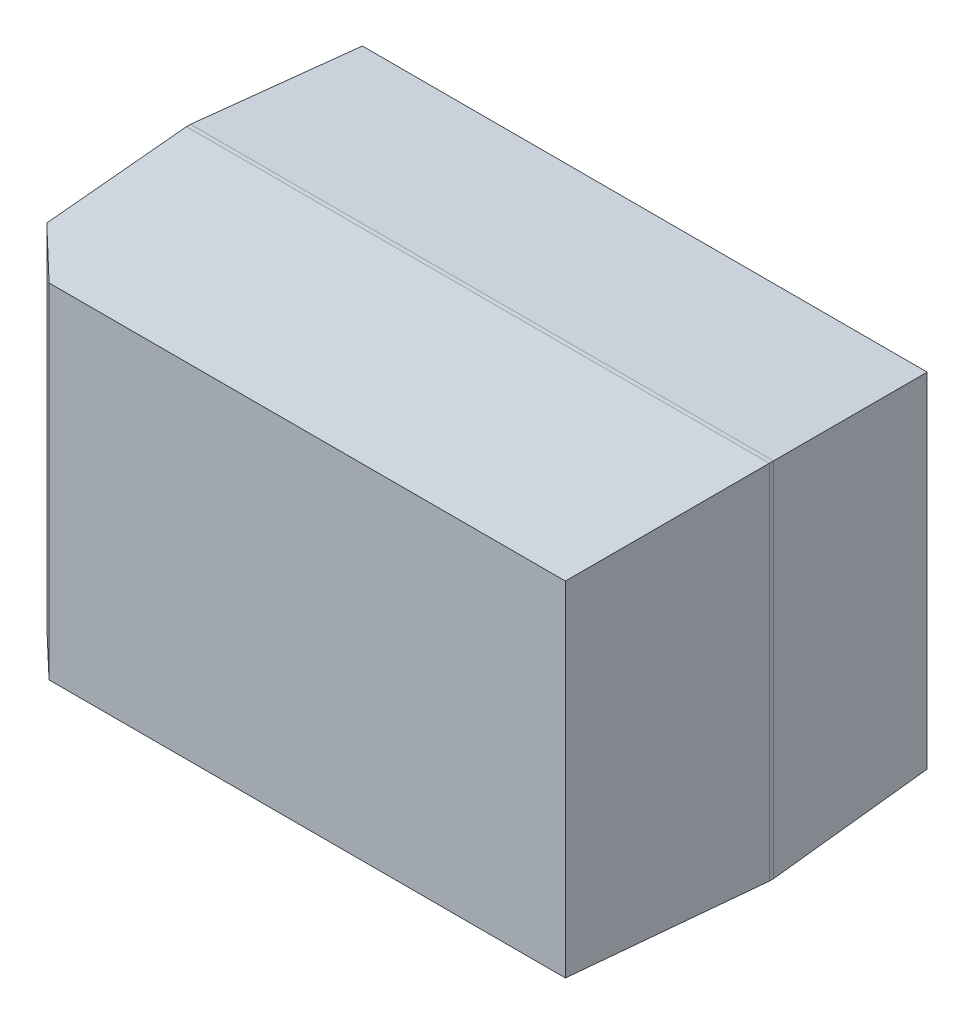
ISO-10303-21;
HEADER;
FILE_DESCRIPTION(('STEP AP214'),'2;1');
FILE_NAME('part.step','',(''),(''),'','','');
FILE_SCHEMA(('AUTOMOTIVE_DESIGN { 1 0 10303 214 1 1 1 1 }'));
ENDSEC;
DATA;
#1=APPLICATION_CONTEXT('core data for automotive mechanical design processes');
#2=APPLICATION_PROTOCOL_DEFINITION('international standard','automotive_design',2000,#1);
#3=PRODUCT_CONTEXT('',#1,'mechanical');
#4=PRODUCT('Part','Part','',(#3));
#5=PRODUCT_RELATED_PRODUCT_CATEGORY('part','',(#4));
#6=PRODUCT_DEFINITION_FORMATION('','',#4);
#7=PRODUCT_DEFINITION_CONTEXT('part definition',#1,'design');
#8=PRODUCT_DEFINITION('design','',#6,#7);
#9=PRODUCT_DEFINITION_SHAPE('','',#8);
#10=(LENGTH_UNIT() NAMED_UNIT(*) SI_UNIT(.MILLI.,.METRE.));
#11=(NAMED_UNIT(*) PLANE_ANGLE_UNIT() SI_UNIT($,.RADIAN.));
#12=(NAMED_UNIT(*) SI_UNIT($,.STERADIAN.) SOLID_ANGLE_UNIT());
#13=UNCERTAINTY_MEASURE_WITH_UNIT(LENGTH_MEASURE(1.E-05),#10,'distance_accuracy_value','');
#14=(GEOMETRIC_REPRESENTATION_CONTEXT(3) GLOBAL_UNCERTAINTY_ASSIGNED_CONTEXT((#13)) GLOBAL_UNIT_ASSIGNED_CONTEXT((#10,
#11,#12)) REPRESENTATION_CONTEXT('',''));
#15=CARTESIAN_POINT('',(0.,0.,0.));
#16=DIRECTION('',(0.,0.,1.));
#17=DIRECTION('',(1.,0.,0.));
#18=AXIS2_PLACEMENT_3D('',#15,#16,#17);
#19=CARTESIAN_POINT('',(-0.644883157121,-0.4275,0.939648242794));
#20=DIRECTION('',(0.690528091039103,0.,-0.723305575456108));
#21=DIRECTION('',(-0.723305575456108,0.,-0.690528091039103));
#22=AXIS2_PLACEMENT_3D('',#19,#20,#21);
#23=PLANE('',#22);
#24=DIRECTION('',(0.722934722308262,-0.0320183834640555,0.690174043558163));
#25=VECTOR('',#24,1.);
#26=CARTESIAN_POINT('',(-0.708099647576,0.433099647575812,0.879296485587991));
#27=LINE('',#26,#25);
#28=CARTESIAN_POINT('',(-0.708099647575812,0.433099647575953,0.879296485587847));
#29=VERTEX_POINT('',#28);
#30=CARTESIAN_POINT('',(-0.581666666666903,0.427499999999999,0.999999999999899));
#31=VERTEX_POINT('',#30);
#32=EDGE_CURVE('E112',#29,#31,#27,.T.);
#33=ORIENTED_EDGE('',*,*,#32,.F.);
#34=DIRECTION('',(0.,1.,0.));
#35=VECTOR('',#34,1.);
#36=CARTESIAN_POINT('',(-0.708099647575812,-0.45,0.879296485587991));
#37=LINE('',#36,#35);
#38=CARTESIAN_POINT('',(-0.708099647575811,-0.433099647575953,0.879296485587847));
#39=VERTEX_POINT('',#38);
#40=EDGE_CURVE('E98',#29,#39,#37,.F.);
#41=ORIENTED_EDGE('',*,*,#40,.T.);
#42=DIRECTION('',(0.722934722308262,0.0320183834640555,0.690174043558163));
#43=VECTOR('',#42,1.);
#44=CARTESIAN_POINT('',(-0.708099647576,-0.433099647575812,0.879296485587991));
#45=LINE('',#44,#43);
#46=CARTESIAN_POINT('',(-0.581666666666903,-0.427499999999998,0.999999999999899));
#47=VERTEX_POINT('',#46);
#48=EDGE_CURVE('E85',#39,#47,#45,.T.);
#49=ORIENTED_EDGE('',*,*,#48,.T.);
#50=DIRECTION('',(0.,1.,0.));
#51=VECTOR('',#50,1.);
#52=CARTESIAN_POINT('',(-0.581666666667,-0.45,1.));
#53=LINE('',#52,#51);
#54=EDGE_CURVE('E20',#31,#47,#53,.F.);
#55=ORIENTED_EDGE('',*,*,#54,.F.);
#56=EDGE_LOOP('',(#33,#41,#49,#55));
#57=FACE_BOUND('',#56,.T.);
#58=ADVANCED_FACE('F17',(#57),#23,.F.);
#59=CARTESIAN_POINT('',(-0.725,-0.45,1.));
#60=DIRECTION('',(0.,0.,1.));
#61=DIRECTION('',(1.,0.,0.));
#62=AXIS2_PLACEMENT_3D('',#59,#60,#61);
#63=PLANE('',#62);
#64=DIRECTION('',(1.,0.,0.));
#65=VECTOR('',#64,1.);
#66=CARTESIAN_POINT('',(-0.725,0.427499999999994,1.));
#67=LINE('',#66,#65);
#68=CARTESIAN_POINT('',(0.702499999999999,0.427499999999999,1.));
#69=VERTEX_POINT('',#68);
#70=EDGE_CURVE('E95',#31,#69,#67,.T.);
#71=ORIENTED_EDGE('',*,*,#70,.F.);
#72=ORIENTED_EDGE('',*,*,#54,.T.);
#73=DIRECTION('',(1.,0.,0.));
#74=VECTOR('',#73,1.);
#75=CARTESIAN_POINT('',(-0.725,-0.427499999999994,1.));
#76=LINE('',#75,#74);
#77=CARTESIAN_POINT('',(0.702499999999999,-0.427499999999997,1.));
#78=VERTEX_POINT('',#77);
#79=EDGE_CURVE('E93',#47,#78,#76,.T.);
#80=ORIENTED_EDGE('',*,*,#79,.T.);
#81=DIRECTION('',(0.,1.,0.));
#82=VECTOR('',#81,1.);
#83=CARTESIAN_POINT('',(0.702499999999994,-0.45,1.));
#84=LINE('',#83,#82);
#85=EDGE_CURVE('E110',#69,#78,#84,.F.);
#86=ORIENTED_EDGE('',*,*,#85,.F.);
#87=EDGE_LOOP('',(#71,#72,#80,#86));
#88=FACE_BOUND('',#87,.T.);
#89=ADVANCED_FACE('F91',(#88),#63,.T.);
#90=CARTESIAN_POINT('',(-0.71375,-0.45,0.7575));
#91=DIRECTION('',(0.998925636515265,0.,-0.0463419109723823));
#92=DIRECTION('',(-0.0463419109723823,0.,-0.998925636515265));
#93=AXIS2_PLACEMENT_3D('',#90,#91,#92);
#94=PLANE('',#93);
#95=DIRECTION('',(0.0462922296664815,-0.0462922296670134,0.997854728377314));
#96=VECTOR('',#95,1.);
#97=CARTESIAN_POINT('',(-0.725,0.450000000000006,0.515));
#98=LINE('',#97,#96);
#99=CARTESIAN_POINT('',(-0.725000000000003,0.450000000000001,0.515));
#100=VERTEX_POINT('',#99);
#101=EDGE_CURVE('E117',#100,#29,#98,.T.);
#102=ORIENTED_EDGE('',*,*,#101,.F.);
#103=DIRECTION('',(0.,1.,0.));
#104=VECTOR('',#103,1.);
#105=CARTESIAN_POINT('',(-0.725,-0.45,0.515));
#106=LINE('',#105,#104);
#107=CARTESIAN_POINT('',(-0.725000000000003,-0.450000000000001,0.515));
#108=VERTEX_POINT('',#107);
#109=EDGE_CURVE('E120',#100,#108,#106,.F.);
#110=ORIENTED_EDGE('',*,*,#109,.T.);
#111=DIRECTION('',(0.0462922296664815,0.0462922296670134,0.997854728377314));
#112=VECTOR('',#111,1.);
#113=CARTESIAN_POINT('',(-0.725,-0.450000000000006,0.515));
#114=LINE('',#113,#112);
#115=EDGE_CURVE('E103',#108,#39,#114,.T.);
#116=ORIENTED_EDGE('',*,*,#115,.T.);
#117=ORIENTED_EDGE('',*,*,#40,.F.);
#118=EDGE_LOOP('',(#102,#110,#116,#117));
#119=FACE_BOUND('',#118,.T.);
#120=ADVANCED_FACE('F225',(#119),#94,.F.);
#121=CARTESIAN_POINT('',(-0.725,-0.43875,0.7575));
#122=DIRECTION('',(0.,0.998925636515265,-0.0463419109723823));
#123=DIRECTION('',(0.,0.0463419109723823,0.998925636515265));
#124=AXIS2_PLACEMENT_3D('',#121,#122,#123);
#125=PLANE('',#124);
#126=DIRECTION('',(1.,0.,0.));
#127=VECTOR('',#126,1.);
#128=CARTESIAN_POINT('',(-0.725,-0.45,0.515));
#129=LINE('',#128,#127);
#130=CARTESIAN_POINT('',(0.725000000000001,-0.450000000000003,0.515));
#131=VERTEX_POINT('',#130);
#132=EDGE_CURVE('E126',#108,#131,#129,.T.);
#133=ORIENTED_EDGE('',*,*,#132,.T.);
#134=DIRECTION('',(0.0462922296670122,-0.0462922296669879,-0.99785472837729));
#135=VECTOR('',#134,1.);
#136=CARTESIAN_POINT('',(0.702499999999994,-0.4275,1.));
#137=LINE('',#136,#135);
#138=EDGE_CURVE('E102',#78,#131,#137,.T.);
#139=ORIENTED_EDGE('',*,*,#138,.F.);
#140=ORIENTED_EDGE('',*,*,#79,.F.);
#141=ORIENTED_EDGE('',*,*,#48,.F.);
#142=ORIENTED_EDGE('',*,*,#115,.F.);
#143=EDGE_LOOP('',(#133,#139,#140,#141,#142));
#144=FACE_BOUND('',#143,.T.);
#145=ADVANCED_FACE('F101',(#144),#125,.F.);
#146=CARTESIAN_POINT('',(0.71375,-0.45,0.7575));
#147=DIRECTION('',(0.998925636515265,0.,0.0463419109723823));
#148=DIRECTION('',(0.0463419109723823,0.,-0.998925636515265));
#149=AXIS2_PLACEMENT_3D('',#146,#147,#148);
#150=PLANE('',#149);
#151=DIRECTION('',(0.0462922296669876,0.0462922296670123,-0.99785472837729));
#152=VECTOR('',#151,1.);
#153=CARTESIAN_POINT('',(0.7025,0.427499999999994,1.));
#154=LINE('',#153,#152);
#155=CARTESIAN_POINT('',(0.725000000000003,0.450000000000001,0.515));
#156=VERTEX_POINT('',#155);
#157=EDGE_CURVE('E115',#69,#156,#154,.T.);
#158=ORIENTED_EDGE('',*,*,#157,.F.);
#159=ORIENTED_EDGE('',*,*,#85,.T.);
#160=ORIENTED_EDGE('',*,*,#138,.T.);
#161=DIRECTION('',(0.,1.,0.));
#162=VECTOR('',#161,1.);
#163=CARTESIAN_POINT('',(0.725,-0.45,0.515));
#164=LINE('',#163,#162);
#165=EDGE_CURVE('E130',#156,#131,#164,.F.);
#166=ORIENTED_EDGE('',*,*,#165,.F.);
#167=EDGE_LOOP('',(#158,#159,#160,#166));
#168=FACE_BOUND('',#167,.T.);
#169=ADVANCED_FACE('F218',(#168),#150,.T.);
#170=CARTESIAN_POINT('',(-0.725,0.43875,0.7575));
#171=DIRECTION('',(0.,0.998925636515265,0.0463419109723823));
#172=DIRECTION('',(0.,-0.0463419109723823,0.998925636515265));
#173=AXIS2_PLACEMENT_3D('',#170,#171,#172);
#174=PLANE('',#173);
#175=DIRECTION('',(1.,0.,0.));
#176=VECTOR('',#175,1.);
#177=CARTESIAN_POINT('',(-0.725,0.45,0.515));
#178=LINE('',#177,#176);
#179=EDGE_CURVE('E138',#100,#156,#178,.T.);
#180=ORIENTED_EDGE('',*,*,#179,.F.);
#181=ORIENTED_EDGE('',*,*,#101,.T.);
#182=ORIENTED_EDGE('',*,*,#32,.T.);
#183=ORIENTED_EDGE('',*,*,#70,.T.);
#184=ORIENTED_EDGE('',*,*,#157,.T.);
#185=EDGE_LOOP('',(#180,#181,#182,#183,#184));
#186=FACE_BOUND('',#185,.T.);
#187=ADVANCED_FACE('F214',(#186),#174,.T.);
#188=CARTESIAN_POINT('',(-0.725,-0.45,0.1));
#189=DIRECTION('',(1.,0.,0.));
#190=DIRECTION('',(0.,0.,-1.));
#191=AXIS2_PLACEMENT_3D('',#188,#189,#190);
#192=PLANE('',#191);
#193=DIRECTION('',(0.,0.,1.));
#194=VECTOR('',#193,1.);
#195=CARTESIAN_POINT('',(-0.725,0.45,0.1));
#196=LINE('',#195,#194);
#197=CARTESIAN_POINT('',(-0.725000000000001,0.450000000000001,0.505));
#198=VERTEX_POINT('',#197);
#199=EDGE_CURVE('E135',#198,#100,#196,.T.);
#200=ORIENTED_EDGE('',*,*,#199,.F.);
#201=DIRECTION('',(0.,1.,0.));
#202=VECTOR('',#201,1.);
#203=CARTESIAN_POINT('',(-0.725000000000008,-0.45,0.505));
#204=LINE('',#203,#202);
#205=CARTESIAN_POINT('',(-0.725000000000001,-0.450000000000001,0.505));
#206=VERTEX_POINT('',#205);
#207=EDGE_CURVE('E141',#206,#198,#204,.T.);
#208=ORIENTED_EDGE('',*,*,#207,.F.);
#209=DIRECTION('',(0.,0.,1.));
#210=VECTOR('',#209,1.);
#211=CARTESIAN_POINT('',(-0.725,-0.45,0.1));
#212=LINE('',#211,#210);
#213=EDGE_CURVE('E123',#206,#108,#212,.T.);
#214=ORIENTED_EDGE('',*,*,#213,.T.);
#215=ORIENTED_EDGE('',*,*,#109,.F.);
#216=EDGE_LOOP('',(#200,#208,#214,#215));
#217=FACE_BOUND('',#216,.T.);
#218=ADVANCED_FACE('F210',(#217),#192,.F.);
#219=CARTESIAN_POINT('',(-0.725,-0.45,0.1));
#220=DIRECTION('',(0.,1.,0.));
#221=DIRECTION('',(0.,0.,1.));
#222=AXIS2_PLACEMENT_3D('',#219,#220,#221);
#223=PLANE('',#222);
#224=ORIENTED_EDGE('',*,*,#213,.F.);
#225=DIRECTION('',(1.,0.,0.));
#226=VECTOR('',#225,1.);
#227=CARTESIAN_POINT('',(-0.725,-0.450000000000008,0.505));
#228=LINE('',#227,#226);
#229=CARTESIAN_POINT('',(0.725000000000001,-0.450000000000002,0.505));
#230=VERTEX_POINT('',#229);
#231=EDGE_CURVE('E143',#230,#206,#228,.F.);
#232=ORIENTED_EDGE('',*,*,#231,.F.);
#233=DIRECTION('',(0.,0.,-1.));
#234=VECTOR('',#233,1.);
#235=CARTESIAN_POINT('',(0.725,-0.45,0.1));
#236=LINE('',#235,#234);
#237=EDGE_CURVE('E128',#131,#230,#236,.T.);
#238=ORIENTED_EDGE('',*,*,#237,.F.);
#239=ORIENTED_EDGE('',*,*,#132,.F.);
#240=EDGE_LOOP('',(#224,#232,#238,#239));
#241=FACE_BOUND('',#240,.T.);
#242=ADVANCED_FACE('F206',(#241),#223,.F.);
#243=CARTESIAN_POINT('',(0.725,-0.45,0.1));
#244=DIRECTION('',(1.,0.,0.));
#245=DIRECTION('',(0.,0.,-1.));
#246=AXIS2_PLACEMENT_3D('',#243,#244,#245);
#247=PLANE('',#246);
#248=DIRECTION('',(0.,0.,1.));
#249=VECTOR('',#248,1.);
#250=CARTESIAN_POINT('',(0.725,0.45,0.1));
#251=LINE('',#250,#249);
#252=CARTESIAN_POINT('',(0.725000000000002,0.450000000000001,0.505));
#253=VERTEX_POINT('',#252);
#254=EDGE_CURVE('E133',#156,#253,#251,.F.);
#255=ORIENTED_EDGE('',*,*,#254,.F.);
#256=ORIENTED_EDGE('',*,*,#165,.T.);
#257=ORIENTED_EDGE('',*,*,#237,.T.);
#258=DIRECTION('',(0.,1.,0.));
#259=VECTOR('',#258,1.);
#260=CARTESIAN_POINT('',(0.725000000000008,-0.45,0.505));
#261=LINE('',#260,#259);
#262=EDGE_CURVE('E151',#230,#253,#261,.T.);
#263=ORIENTED_EDGE('',*,*,#262,.T.);
#264=EDGE_LOOP('',(#255,#256,#257,#263));
#265=FACE_BOUND('',#264,.T.);
#266=ADVANCED_FACE('F202',(#265),#247,.T.);
#267=CARTESIAN_POINT('',(-0.725,0.45,0.1));
#268=DIRECTION('',(0.,1.,0.));
#269=DIRECTION('',(0.,0.,1.));
#270=AXIS2_PLACEMENT_3D('',#267,#268,#269);
#271=PLANE('',#270);
#272=ORIENTED_EDGE('',*,*,#199,.T.);
#273=ORIENTED_EDGE('',*,*,#179,.T.);
#274=ORIENTED_EDGE('',*,*,#254,.T.);
#275=DIRECTION('',(1.,0.,0.));
#276=VECTOR('',#275,1.);
#277=CARTESIAN_POINT('',(-0.725,0.450000000000008,0.505));
#278=LINE('',#277,#276);
#279=EDGE_CURVE('E155',#253,#198,#278,.F.);
#280=ORIENTED_EDGE('',*,*,#279,.T.);
#281=EDGE_LOOP('',(#272,#273,#274,#280));
#282=FACE_BOUND('',#281,.T.);
#283=ADVANCED_FACE('F199',(#282),#271,.T.);
#284=CARTESIAN_POINT('',(-0.71375,-0.45,0.3025));
#285=DIRECTION('',(-0.99846035320541,0.,-0.0554700196225628));
#286=DIRECTION('',(-0.0554700196225628,0.,0.99846035320541));
#287=AXIS2_PLACEMENT_3D('',#284,#285,#286);
#288=PLANE('',#287);
#289=DIRECTION('',(0.055384877562171,-0.055384877562211,-0.996927796119078));
#290=VECTOR('',#289,1.);
#291=CARTESIAN_POINT('',(-0.725,0.450000000000008,0.505));
#292=LINE('',#291,#290);
#293=CARTESIAN_POINT('',(-0.702499999999996,0.427499999999998,0.1));
#294=VERTEX_POINT('',#293);
#295=EDGE_CURVE('E158',#198,#294,#292,.T.);
#296=ORIENTED_EDGE('',*,*,#295,.T.);
#297=DIRECTION('',(0.,1.,0.));
#298=VECTOR('',#297,1.);
#299=CARTESIAN_POINT('',(-0.7025,-0.45,0.1));
#300=LINE('',#299,#298);
#301=CARTESIAN_POINT('',(-0.702499999999996,-0.427499999999998,0.1));
#302=VERTEX_POINT('',#301);
#303=EDGE_CURVE('E161',#294,#302,#300,.F.);
#304=ORIENTED_EDGE('',*,*,#303,.T.);
#305=DIRECTION('',(0.055384877562171,0.055384877562211,-0.996927796119078));
#306=VECTOR('',#305,1.);
#307=CARTESIAN_POINT('',(-0.725,-0.450000000000008,0.505));
#308=LINE('',#307,#306);
#309=EDGE_CURVE('E146',#206,#302,#308,.T.);
#310=ORIENTED_EDGE('',*,*,#309,.F.);
#311=ORIENTED_EDGE('',*,*,#207,.T.);
#312=EDGE_LOOP('',(#296,#304,#310,#311));
#313=FACE_BOUND('',#312,.T.);
#314=ADVANCED_FACE('F181',(#313),#288,.T.);
#315=CARTESIAN_POINT('',(-0.725,-0.43875,0.3025));
#316=DIRECTION('',(0.,-0.99846035320541,-0.0554700196225628));
#317=DIRECTION('',(0.,0.0554700196225628,-0.99846035320541));
#318=AXIS2_PLACEMENT_3D('',#315,#316,#317);
#319=PLANE('',#318);
#320=ORIENTED_EDGE('',*,*,#231,.T.);
#321=ORIENTED_EDGE('',*,*,#309,.T.);
#322=DIRECTION('',(1.,0.,0.));
#323=VECTOR('',#322,1.);
#324=CARTESIAN_POINT('',(-0.725,-0.4275,0.1));
#325=LINE('',#324,#323);
#326=CARTESIAN_POINT('',(0.702499999999998,-0.427499999999996,0.1));
#327=VERTEX_POINT('',#326);
#328=EDGE_CURVE('E164',#302,#327,#325,.T.);
#329=ORIENTED_EDGE('',*,*,#328,.T.);
#330=DIRECTION('',(0.055384877562211,-0.0553848775621713,0.996927796119078));
#331=VECTOR('',#330,1.);
#332=CARTESIAN_POINT('',(0.702499999999992,-0.4275,0.1));
#333=LINE('',#332,#331);
#334=EDGE_CURVE('E148',#327,#230,#333,.T.);
#335=ORIENTED_EDGE('',*,*,#334,.T.);
#336=EDGE_LOOP('',(#320,#321,#329,#335));
#337=FACE_BOUND('',#336,.T.);
#338=ADVANCED_FACE('F176',(#337),#319,.T.);
#339=CARTESIAN_POINT('',(0.71375,-0.45,0.3025));
#340=DIRECTION('',(-0.99846035320541,0.,0.0554700196225628));
#341=DIRECTION('',(0.0554700196225628,0.,0.99846035320541));
#342=AXIS2_PLACEMENT_3D('',#339,#340,#341);
#343=PLANE('',#342);
#344=DIRECTION('',(0.055384877562171,0.055384877562211,0.996927796119078));
#345=VECTOR('',#344,1.);
#346=CARTESIAN_POINT('',(0.7025,0.427499999999992,0.1));
#347=LINE('',#346,#345);
#348=CARTESIAN_POINT('',(0.702499999999996,0.427499999999998,0.1));
#349=VERTEX_POINT('',#348);
#350=EDGE_CURVE('E34',#349,#253,#347,.T.);
#351=ORIENTED_EDGE('',*,*,#350,.T.);
#352=ORIENTED_EDGE('',*,*,#262,.F.);
#353=ORIENTED_EDGE('',*,*,#334,.F.);
#354=DIRECTION('',(0.,1.,0.));
#355=VECTOR('',#354,1.);
#356=CARTESIAN_POINT('',(0.7025,-0.45,0.1));
#357=LINE('',#356,#355);
#358=EDGE_CURVE('E26',#327,#349,#357,.T.);
#359=ORIENTED_EDGE('',*,*,#358,.T.);
#360=EDGE_LOOP('',(#351,#352,#353,#359));
#361=FACE_BOUND('',#360,.T.);
#362=ADVANCED_FACE('F170',(#361),#343,.F.);
#363=CARTESIAN_POINT('',(-0.725,0.43875,0.3025));
#364=DIRECTION('',(0.,-0.99846035320541,0.0554700196225628));
#365=DIRECTION('',(0.,-0.0554700196225628,-0.99846035320541));
#366=AXIS2_PLACEMENT_3D('',#363,#364,#365);
#367=PLANE('',#366);
#368=ORIENTED_EDGE('',*,*,#279,.F.);
#369=ORIENTED_EDGE('',*,*,#350,.F.);
#370=DIRECTION('',(1.,0.,0.));
#371=VECTOR('',#370,1.);
#372=CARTESIAN_POINT('',(-0.725,0.4275,0.1));
#373=LINE('',#372,#371);
#374=EDGE_CURVE('E11',#349,#294,#373,.F.);
#375=ORIENTED_EDGE('',*,*,#374,.T.);
#376=ORIENTED_EDGE('',*,*,#295,.F.);
#377=EDGE_LOOP('',(#368,#369,#375,#376));
#378=FACE_BOUND('',#377,.T.);
#379=ADVANCED_FACE('F184',(#378),#367,.F.);
#380=CARTESIAN_POINT('',(-0.725,-0.45,0.1));
#381=DIRECTION('',(0.,0.,1.));
#382=DIRECTION('',(1.,0.,0.));
#383=AXIS2_PLACEMENT_3D('',#380,#381,#382);
#384=PLANE('',#383);
#385=ORIENTED_EDGE('',*,*,#358,.F.);
#386=ORIENTED_EDGE('',*,*,#328,.F.);
#387=ORIENTED_EDGE('',*,*,#303,.F.);
#388=ORIENTED_EDGE('',*,*,#374,.F.);
#389=EDGE_LOOP('',(#385,#386,#387,#388));
#390=FACE_BOUND('',#389,.T.);
#391=ADVANCED_FACE('F174',(#390),#384,.F.);
#392=CLOSED_SHELL('',(#58,#89,#120,#145,#169,#187,#218,#242,#266,#283,#314,#338,#362,#379,#391));
#393=MANIFOLD_SOLID_BREP('B1',#392);
#394=ADVANCED_BREP_SHAPE_REPRESENTATION('',(#18,#393),#14);
#395=SHAPE_DEFINITION_REPRESENTATION(#9,#394);
ENDSEC;
END-ISO-10303-21;
